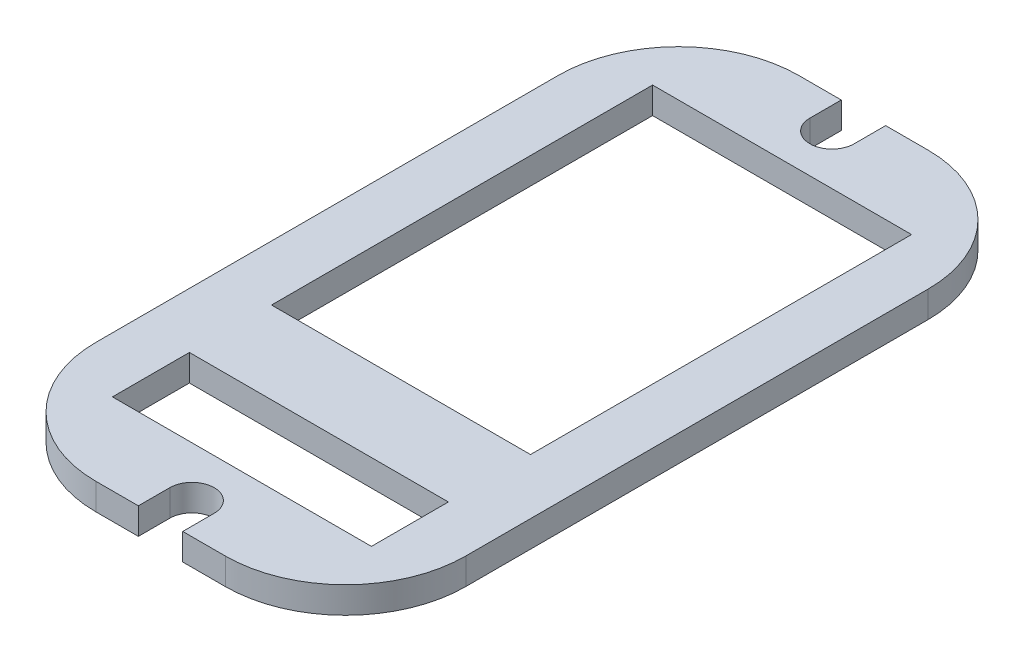
ISO-10303-21;
HEADER;
FILE_DESCRIPTION(('STEP AP214'),'2;1');
FILE_NAME('part.step','',(''),(''),'','','');
FILE_SCHEMA(('AUTOMOTIVE_DESIGN { 1 0 10303 214 1 1 1 1 }'));
ENDSEC;
DATA;
#1=APPLICATION_CONTEXT('core data for automotive mechanical design processes');
#2=APPLICATION_PROTOCOL_DEFINITION('international standard','automotive_design',2000,#1);
#3=PRODUCT_CONTEXT('',#1,'mechanical');
#4=PRODUCT('Part','Part','',(#3));
#5=PRODUCT_RELATED_PRODUCT_CATEGORY('part','',(#4));
#6=PRODUCT_DEFINITION_FORMATION('','',#4);
#7=PRODUCT_DEFINITION_CONTEXT('part definition',#1,'design');
#8=PRODUCT_DEFINITION('design','',#6,#7);
#9=PRODUCT_DEFINITION_SHAPE('','',#8);
#10=(LENGTH_UNIT() NAMED_UNIT(*) SI_UNIT(.MILLI.,.METRE.));
#11=(NAMED_UNIT(*) PLANE_ANGLE_UNIT() SI_UNIT($,.RADIAN.));
#12=(NAMED_UNIT(*) SI_UNIT($,.STERADIAN.) SOLID_ANGLE_UNIT());
#13=UNCERTAINTY_MEASURE_WITH_UNIT(LENGTH_MEASURE(1.E-05),#10,'distance_accuracy_value','');
#14=(GEOMETRIC_REPRESENTATION_CONTEXT(3) GLOBAL_UNCERTAINTY_ASSIGNED_CONTEXT((#13)) GLOBAL_UNIT_ASSIGNED_CONTEXT((#10,
#11,#12)) REPRESENTATION_CONTEXT('',''));
#15=CARTESIAN_POINT('',(0.,0.,0.));
#16=DIRECTION('',(0.,0.,1.));
#17=DIRECTION('',(1.,0.,0.));
#18=AXIS2_PLACEMENT_3D('',#15,#16,#17);
#19=CARTESIAN_POINT('',(0.,0.716,-8.65));
#20=DIRECTION('',(0.,1.,0.));
#21=DIRECTION('',(0.,0.,1.));
#22=AXIS2_PLACEMENT_3D('',#19,#20,#21);
#23=PLANE('',#22);
#24=CARTESIAN_POINT('',(0.,0.716,-8.65));
#25=DIRECTION('',(0.,-1.,0.));
#26=DIRECTION('',(0.,0.,1.));
#27=AXIS2_PLACEMENT_3D('',#24,#25,#26);
#28=CIRCLE('',#27,0.599999999999999);
#29=CARTESIAN_POINT('',(0.599999999999996,0.716,-8.65));
#30=VERTEX_POINT('',#29);
#31=CARTESIAN_POINT('',(-0.600000000000002,0.716,-8.65));
#32=VERTEX_POINT('',#31);
#33=EDGE_CURVE('E261',#30,#32,#28,.T.);
#34=ORIENTED_EDGE('',*,*,#33,.T.);
#35=DIRECTION('',(0.,0.,-1.));
#36=VECTOR('',#35,1.);
#37=CARTESIAN_POINT('',(-0.600000000000005,0.716,-9.5));
#38=LINE('',#37,#36);
#39=CARTESIAN_POINT('',(-0.600000000000005,0.716,-9.5));
#40=VERTEX_POINT('',#39);
#41=EDGE_CURVE('E264',#32,#40,#38,.T.);
#42=ORIENTED_EDGE('',*,*,#41,.T.);
#43=DIRECTION('',(-1.,0.,0.));
#44=VECTOR('',#43,1.);
#45=CARTESIAN_POINT('',(-0.600000000000005,0.716,-9.5));
#46=LINE('',#45,#44);
#47=CARTESIAN_POINT('',(-1.75000000000001,0.716,-9.5));
#48=VERTEX_POINT('',#47);
#49=EDGE_CURVE('E267',#40,#48,#46,.T.);
#50=ORIENTED_EDGE('',*,*,#49,.T.);
#51=CARTESIAN_POINT('',(-1.75000000000001,0.716,-6.25));
#52=DIRECTION('',(0.,1.,0.));
#53=DIRECTION('',(0.,0.,1.));
#54=AXIS2_PLACEMENT_3D('',#51,#52,#53);
#55=CIRCLE('',#54,3.25);
#56=CARTESIAN_POINT('',(-5.,0.716,-6.25));
#57=VERTEX_POINT('',#56);
#58=EDGE_CURVE('E269',#48,#57,#55,.T.);
#59=ORIENTED_EDGE('',*,*,#58,.T.);
#60=DIRECTION('',(0.,0.,1.));
#61=VECTOR('',#60,1.);
#62=CARTESIAN_POINT('',(-5.,0.716,-6.25));
#63=LINE('',#62,#61);
#64=CARTESIAN_POINT('',(-5.,0.716,6.25000000000001));
#65=VERTEX_POINT('',#64);
#66=EDGE_CURVE('E271',#57,#65,#63,.T.);
#67=ORIENTED_EDGE('',*,*,#66,.T.);
#68=CARTESIAN_POINT('',(-1.75000000000001,0.716,6.25000000000001));
#69=DIRECTION('',(0.,1.,0.));
#70=DIRECTION('',(0.,0.,1.));
#71=AXIS2_PLACEMENT_3D('',#68,#69,#70);
#72=CIRCLE('',#71,3.24999999999999);
#73=CARTESIAN_POINT('',(-1.75,0.716,9.5));
#74=VERTEX_POINT('',#73);
#75=EDGE_CURVE('E273',#65,#74,#72,.T.);
#76=ORIENTED_EDGE('',*,*,#75,.T.);
#77=DIRECTION('',(1.,0.,0.));
#78=VECTOR('',#77,1.);
#79=CARTESIAN_POINT('',(-1.75000000000001,0.716,9.5));
#80=LINE('',#79,#78);
#81=CARTESIAN_POINT('',(-0.600000000000005,0.716,9.5));
#82=VERTEX_POINT('',#81);
#83=EDGE_CURVE('E275',#74,#82,#80,.T.);
#84=ORIENTED_EDGE('',*,*,#83,.T.);
#85=DIRECTION('',(0.,0.,-1.));
#86=VECTOR('',#85,1.);
#87=CARTESIAN_POINT('',(-0.599999999999991,0.716,8.65));
#88=LINE('',#87,#86);
#89=CARTESIAN_POINT('',(-0.599999999999991,0.716,8.65));
#90=VERTEX_POINT('',#89);
#91=EDGE_CURVE('E277',#82,#90,#88,.T.);
#92=ORIENTED_EDGE('',*,*,#91,.T.);
#93=CARTESIAN_POINT('',(0.,0.716,8.65));
#94=DIRECTION('',(0.,-1.,0.));
#95=DIRECTION('',(0.,0.,1.));
#96=AXIS2_PLACEMENT_3D('',#93,#94,#95);
#97=CIRCLE('',#96,0.599999999999996);
#98=CARTESIAN_POINT('',(0.599999999999998,0.716,8.65));
#99=VERTEX_POINT('',#98);
#100=EDGE_CURVE('E279',#90,#99,#97,.T.);
#101=ORIENTED_EDGE('',*,*,#100,.T.);
#102=DIRECTION('',(0.,0.,1.));
#103=VECTOR('',#102,1.);
#104=CARTESIAN_POINT('',(0.600000000000001,0.716,8.65));
#105=LINE('',#104,#103);
#106=CARTESIAN_POINT('',(0.599999999999993,0.716,9.5));
#107=VERTEX_POINT('',#106);
#108=EDGE_CURVE('E281',#99,#107,#105,.T.);
#109=ORIENTED_EDGE('',*,*,#108,.T.);
#110=DIRECTION('',(1.,0.,0.));
#111=VECTOR('',#110,1.);
#112=CARTESIAN_POINT('',(0.599999999999993,0.716,9.5));
#113=LINE('',#112,#111);
#114=CARTESIAN_POINT('',(1.75,0.716,9.5));
#115=VERTEX_POINT('',#114);
#116=EDGE_CURVE('E283',#107,#115,#113,.T.);
#117=ORIENTED_EDGE('',*,*,#116,.T.);
#118=CARTESIAN_POINT('',(1.75000000000001,0.716,6.25));
#119=DIRECTION('',(0.,1.,0.));
#120=DIRECTION('',(0.,0.,1.));
#121=AXIS2_PLACEMENT_3D('',#118,#119,#120);
#122=CIRCLE('',#121,3.25);
#123=CARTESIAN_POINT('',(5.,0.716,6.25000000000001));
#124=VERTEX_POINT('',#123);
#125=EDGE_CURVE('E285',#115,#124,#122,.T.);
#126=ORIENTED_EDGE('',*,*,#125,.T.);
#127=DIRECTION('',(0.,0.,-1.));
#128=VECTOR('',#127,1.);
#129=CARTESIAN_POINT('',(5.,0.716,6.25000000000001));
#130=LINE('',#129,#128);
#131=CARTESIAN_POINT('',(5.,0.716,-6.25));
#132=VERTEX_POINT('',#131);
#133=EDGE_CURVE('E287',#124,#132,#130,.T.);
#134=ORIENTED_EDGE('',*,*,#133,.T.);
#135=CARTESIAN_POINT('',(1.75,0.716,-6.25));
#136=DIRECTION('',(0.,1.,0.));
#137=DIRECTION('',(0.,0.,1.));
#138=AXIS2_PLACEMENT_3D('',#135,#136,#137);
#139=CIRCLE('',#138,3.25);
#140=CARTESIAN_POINT('',(1.75,0.716,-9.5));
#141=VERTEX_POINT('',#140);
#142=EDGE_CURVE('E289',#132,#141,#139,.T.);
#143=ORIENTED_EDGE('',*,*,#142,.T.);
#144=DIRECTION('',(-1.,0.,0.));
#145=VECTOR('',#144,1.);
#146=CARTESIAN_POINT('',(1.75,0.716,-9.5));
#147=LINE('',#146,#145);
#148=CARTESIAN_POINT('',(0.599999999999993,0.716,-9.5));
#149=VERTEX_POINT('',#148);
#150=EDGE_CURVE('E291',#141,#149,#147,.T.);
#151=ORIENTED_EDGE('',*,*,#150,.T.);
#152=DIRECTION('',(0.,0.,1.));
#153=VECTOR('',#152,1.);
#154=CARTESIAN_POINT('',(0.599999999999993,0.716,-9.5));
#155=LINE('',#154,#153);
#156=EDGE_CURVE('E293',#149,#30,#155,.T.);
#157=ORIENTED_EDGE('',*,*,#156,.T.);
#158=EDGE_LOOP('',(#34,#42,#50,#59,#67,#76,#84,#92,#101,#109,#117,#126,#134,#143,#151,#157));
#159=FACE_BOUND('',#158,.T.);
#160=DIRECTION('',(1.,0.,0.));
#161=VECTOR('',#160,1.);
#162=CARTESIAN_POINT('',(-3.5,0.716,3.));
#163=LINE('',#162,#161);
#164=CARTESIAN_POINT('',(-3.5,0.716,3.));
#165=VERTEX_POINT('',#164);
#166=CARTESIAN_POINT('',(3.5,0.716,3.));
#167=VERTEX_POINT('',#166);
#168=EDGE_CURVE('E232',#165,#167,#163,.T.);
#169=ORIENTED_EDGE('',*,*,#168,.F.);
#170=DIRECTION('',(0.,0.,1.));
#171=VECTOR('',#170,1.);
#172=CARTESIAN_POINT('',(-3.5,0.716,-7.3));
#173=LINE('',#172,#171);
#174=CARTESIAN_POINT('',(-3.5,0.716,-7.3));
#175=VERTEX_POINT('',#174);
#176=EDGE_CURVE('E230',#175,#165,#173,.T.);
#177=ORIENTED_EDGE('',*,*,#176,.F.);
#178=DIRECTION('',(-1.,0.,0.));
#179=VECTOR('',#178,1.);
#180=CARTESIAN_POINT('',(3.5,0.716,-7.3));
#181=LINE('',#180,#179);
#182=CARTESIAN_POINT('',(3.5,0.716,-7.3));
#183=VERTEX_POINT('',#182);
#184=EDGE_CURVE('E238',#183,#175,#181,.T.);
#185=ORIENTED_EDGE('',*,*,#184,.F.);
#186=DIRECTION('',(0.,0.,-1.));
#187=VECTOR('',#186,1.);
#188=CARTESIAN_POINT('',(3.5,0.716,3.));
#189=LINE('',#188,#187);
#190=EDGE_CURVE('E235',#167,#183,#189,.T.);
#191=ORIENTED_EDGE('',*,*,#190,.F.);
#192=EDGE_LOOP('',(#169,#177,#185,#191));
#193=FACE_BOUND('',#192,.T.);
#194=DIRECTION('',(1.,0.,0.));
#195=VECTOR('',#194,1.);
#196=CARTESIAN_POINT('',(-3.5,0.716,7.3));
#197=LINE('',#196,#195);
#198=CARTESIAN_POINT('',(-3.5,0.716,7.3));
#199=VERTEX_POINT('',#198);
#200=CARTESIAN_POINT('',(3.5,0.716,7.3));
#201=VERTEX_POINT('',#200);
#202=EDGE_CURVE('E202',#199,#201,#197,.T.);
#203=ORIENTED_EDGE('',*,*,#202,.F.);
#204=DIRECTION('',(0.,0.,1.));
#205=VECTOR('',#204,1.);
#206=CARTESIAN_POINT('',(-3.5,0.716,5.22));
#207=LINE('',#206,#205);
#208=CARTESIAN_POINT('',(-3.5,0.716,5.22));
#209=VERTEX_POINT('',#208);
#210=EDGE_CURVE('E194',#209,#199,#207,.T.);
#211=ORIENTED_EDGE('',*,*,#210,.F.);
#212=DIRECTION('',(-1.,0.,0.));
#213=VECTOR('',#212,1.);
#214=CARTESIAN_POINT('',(3.5,0.716,5.22));
#215=LINE('',#214,#213);
#216=CARTESIAN_POINT('',(3.5,0.716,5.22));
#217=VERTEX_POINT('',#216);
#218=EDGE_CURVE('E216',#217,#209,#215,.T.);
#219=ORIENTED_EDGE('',*,*,#218,.F.);
#220=DIRECTION('',(0.,0.,-1.));
#221=VECTOR('',#220,1.);
#222=CARTESIAN_POINT('',(3.5,0.716,7.3));
#223=LINE('',#222,#221);
#224=EDGE_CURVE('E214',#201,#217,#223,.T.);
#225=ORIENTED_EDGE('',*,*,#224,.F.);
#226=EDGE_LOOP('',(#203,#211,#219,#225));
#227=FACE_BOUND('',#226,.T.);
#228=ADVANCED_FACE('F33',(#159,#193,#227),#23,.T.);
#229=CARTESIAN_POINT('',(0.,0.,-8.65));
#230=DIRECTION('',(0.,1.,0.));
#231=DIRECTION('',(0.,0.,1.));
#232=AXIS2_PLACEMENT_3D('',#229,#230,#231);
#233=PLANE('',#232);
#234=DIRECTION('',(0.,0.,1.));
#235=VECTOR('',#234,1.);
#236=CARTESIAN_POINT('',(-3.5,0.,-7.3));
#237=LINE('',#236,#235);
#238=CARTESIAN_POINT('',(-3.5,0.,-7.3));
#239=VERTEX_POINT('',#238);
#240=CARTESIAN_POINT('',(-3.5,0.,3.));
#241=VERTEX_POINT('',#240);
#242=EDGE_CURVE('E210',#239,#241,#237,.T.);
#243=ORIENTED_EDGE('',*,*,#242,.T.);
#244=DIRECTION('',(1.,0.,0.));
#245=VECTOR('',#244,1.);
#246=CARTESIAN_POINT('',(-3.5,0.,3.));
#247=LINE('',#246,#245);
#248=CARTESIAN_POINT('',(3.5,0.,3.));
#249=VERTEX_POINT('',#248);
#250=EDGE_CURVE('E243',#241,#249,#247,.T.);
#251=ORIENTED_EDGE('',*,*,#250,.T.);
#252=DIRECTION('',(0.,0.,-1.));
#253=VECTOR('',#252,1.);
#254=CARTESIAN_POINT('',(3.5,0.,3.));
#255=LINE('',#254,#253);
#256=CARTESIAN_POINT('',(3.5,0.,-7.3));
#257=VERTEX_POINT('',#256);
#258=EDGE_CURVE('E246',#249,#257,#255,.T.);
#259=ORIENTED_EDGE('',*,*,#258,.T.);
#260=DIRECTION('',(-1.,0.,0.));
#261=VECTOR('',#260,1.);
#262=CARTESIAN_POINT('',(3.5,0.,-7.3));
#263=LINE('',#262,#261);
#264=EDGE_CURVE('E233',#257,#239,#263,.T.);
#265=ORIENTED_EDGE('',*,*,#264,.T.);
#266=EDGE_LOOP('',(#243,#251,#259,#265));
#267=FACE_BOUND('',#266,.T.);
#268=CARTESIAN_POINT('',(0.,0.,-8.65));
#269=DIRECTION('',(0.,-1.,0.));
#270=DIRECTION('',(0.,0.,1.));
#271=AXIS2_PLACEMENT_3D('',#268,#269,#270);
#272=CIRCLE('',#271,0.599999999999999);
#273=CARTESIAN_POINT('',(0.599999999999996,0.,-8.65));
#274=VERTEX_POINT('',#273);
#275=CARTESIAN_POINT('',(-0.600000000000002,0.,-8.65));
#276=VERTEX_POINT('',#275);
#277=EDGE_CURVE('E260',#274,#276,#272,.T.);
#278=ORIENTED_EDGE('',*,*,#277,.F.);
#279=DIRECTION('',(0.,0.,1.));
#280=VECTOR('',#279,1.);
#281=CARTESIAN_POINT('',(0.599999999999993,0.,-9.5));
#282=LINE('',#281,#280);
#283=CARTESIAN_POINT('',(0.599999999999993,0.,-9.5));
#284=VERTEX_POINT('',#283);
#285=EDGE_CURVE('E265',#284,#274,#282,.T.);
#286=ORIENTED_EDGE('',*,*,#285,.F.);
#287=DIRECTION('',(-1.,0.,0.));
#288=VECTOR('',#287,1.);
#289=CARTESIAN_POINT('',(1.75,0.,-9.5));
#290=LINE('',#289,#288);
#291=CARTESIAN_POINT('',(1.75,0.,-9.5));
#292=VERTEX_POINT('',#291);
#293=EDGE_CURVE('E324',#292,#284,#290,.T.);
#294=ORIENTED_EDGE('',*,*,#293,.F.);
#295=CARTESIAN_POINT('',(1.75,0.,-6.25));
#296=DIRECTION('',(0.,1.,0.));
#297=DIRECTION('',(0.,0.,1.));
#298=AXIS2_PLACEMENT_3D('',#295,#296,#297);
#299=CIRCLE('',#298,3.25);
#300=CARTESIAN_POINT('',(5.,0.,-6.25));
#301=VERTEX_POINT('',#300);
#302=EDGE_CURVE('E322',#301,#292,#299,.T.);
#303=ORIENTED_EDGE('',*,*,#302,.F.);
#304=DIRECTION('',(0.,0.,-1.));
#305=VECTOR('',#304,1.);
#306=CARTESIAN_POINT('',(5.,0.,6.25000000000001));
#307=LINE('',#306,#305);
#308=CARTESIAN_POINT('',(5.,0.,6.25000000000001));
#309=VERTEX_POINT('',#308);
#310=EDGE_CURVE('E320',#309,#301,#307,.T.);
#311=ORIENTED_EDGE('',*,*,#310,.F.);
#312=CARTESIAN_POINT('',(1.75000000000001,0.,6.25));
#313=DIRECTION('',(0.,1.,0.));
#314=DIRECTION('',(0.,0.,1.));
#315=AXIS2_PLACEMENT_3D('',#312,#313,#314);
#316=CIRCLE('',#315,3.25);
#317=CARTESIAN_POINT('',(1.75,0.,9.5));
#318=VERTEX_POINT('',#317);
#319=EDGE_CURVE('E318',#318,#309,#316,.T.);
#320=ORIENTED_EDGE('',*,*,#319,.F.);
#321=DIRECTION('',(1.,0.,0.));
#322=VECTOR('',#321,1.);
#323=CARTESIAN_POINT('',(0.599999999999993,0.,9.5));
#324=LINE('',#323,#322);
#325=CARTESIAN_POINT('',(0.599999999999993,0.,9.5));
#326=VERTEX_POINT('',#325);
#327=EDGE_CURVE('E316',#326,#318,#324,.T.);
#328=ORIENTED_EDGE('',*,*,#327,.F.);
#329=DIRECTION('',(0.,0.,1.));
#330=VECTOR('',#329,1.);
#331=CARTESIAN_POINT('',(0.600000000000001,0.,8.65));
#332=LINE('',#331,#330);
#333=CARTESIAN_POINT('',(0.599999999999998,0.,8.65));
#334=VERTEX_POINT('',#333);
#335=EDGE_CURVE('E314',#334,#326,#332,.T.);
#336=ORIENTED_EDGE('',*,*,#335,.F.);
#337=CARTESIAN_POINT('',(0.,0.,8.65));
#338=DIRECTION('',(0.,-1.,0.));
#339=DIRECTION('',(0.,0.,1.));
#340=AXIS2_PLACEMENT_3D('',#337,#338,#339);
#341=CIRCLE('',#340,0.599999999999996);
#342=CARTESIAN_POINT('',(-0.599999999999991,0.,8.65));
#343=VERTEX_POINT('',#342);
#344=EDGE_CURVE('E312',#343,#334,#341,.T.);
#345=ORIENTED_EDGE('',*,*,#344,.F.);
#346=DIRECTION('',(0.,0.,-1.));
#347=VECTOR('',#346,1.);
#348=CARTESIAN_POINT('',(-0.599999999999991,0.,8.65));
#349=LINE('',#348,#347);
#350=CARTESIAN_POINT('',(-0.600000000000005,0.,9.5));
#351=VERTEX_POINT('',#350);
#352=EDGE_CURVE('E310',#351,#343,#349,.T.);
#353=ORIENTED_EDGE('',*,*,#352,.F.);
#354=DIRECTION('',(1.,0.,0.));
#355=VECTOR('',#354,1.);
#356=CARTESIAN_POINT('',(-1.75000000000001,0.,9.5));
#357=LINE('',#356,#355);
#358=CARTESIAN_POINT('',(-1.75,0.,9.5));
#359=VERTEX_POINT('',#358);
#360=EDGE_CURVE('E308',#359,#351,#357,.T.);
#361=ORIENTED_EDGE('',*,*,#360,.F.);
#362=CARTESIAN_POINT('',(-1.75000000000001,0.,6.25000000000001));
#363=DIRECTION('',(0.,1.,0.));
#364=DIRECTION('',(0.,0.,1.));
#365=AXIS2_PLACEMENT_3D('',#362,#363,#364);
#366=CIRCLE('',#365,3.24999999999999);
#367=CARTESIAN_POINT('',(-5.,0.,6.25000000000001));
#368=VERTEX_POINT('',#367);
#369=EDGE_CURVE('E306',#368,#359,#366,.T.);
#370=ORIENTED_EDGE('',*,*,#369,.F.);
#371=DIRECTION('',(0.,0.,1.));
#372=VECTOR('',#371,1.);
#373=CARTESIAN_POINT('',(-5.,0.,-6.25));
#374=LINE('',#373,#372);
#375=CARTESIAN_POINT('',(-5.,0.,-6.25));
#376=VERTEX_POINT('',#375);
#377=EDGE_CURVE('E304',#376,#368,#374,.T.);
#378=ORIENTED_EDGE('',*,*,#377,.F.);
#379=CARTESIAN_POINT('',(-1.75000000000001,0.,-6.25));
#380=DIRECTION('',(0.,1.,0.));
#381=DIRECTION('',(0.,0.,1.));
#382=AXIS2_PLACEMENT_3D('',#379,#380,#381);
#383=CIRCLE('',#382,3.25);
#384=CARTESIAN_POINT('',(-1.75000000000001,0.,-9.5));
#385=VERTEX_POINT('',#384);
#386=EDGE_CURVE('E302',#385,#376,#383,.T.);
#387=ORIENTED_EDGE('',*,*,#386,.F.);
#388=DIRECTION('',(-1.,0.,0.));
#389=VECTOR('',#388,1.);
#390=CARTESIAN_POINT('',(-0.600000000000005,0.,-9.5));
#391=LINE('',#390,#389);
#392=CARTESIAN_POINT('',(-0.600000000000005,0.,-9.5));
#393=VERTEX_POINT('',#392);
#394=EDGE_CURVE('E300',#393,#385,#391,.T.);
#395=ORIENTED_EDGE('',*,*,#394,.F.);
#396=DIRECTION('',(0.,0.,-1.));
#397=VECTOR('',#396,1.);
#398=CARTESIAN_POINT('',(-0.600000000000005,0.,-9.5));
#399=LINE('',#398,#397);
#400=EDGE_CURVE('E298',#276,#393,#399,.T.);
#401=ORIENTED_EDGE('',*,*,#400,.F.);
#402=EDGE_LOOP('',(#278,#286,#294,#303,#311,#320,#328,#336,#345,#353,#361,#370,#378,#387,#395,#401));
#403=FACE_BOUND('',#402,.T.);
#404=DIRECTION('',(0.,0.,1.));
#405=VECTOR('',#404,1.);
#406=CARTESIAN_POINT('',(-3.5,0.,5.22));
#407=LINE('',#406,#405);
#408=CARTESIAN_POINT('',(-3.5,0.,5.22));
#409=VERTEX_POINT('',#408);
#410=CARTESIAN_POINT('',(-3.5,0.,7.3));
#411=VERTEX_POINT('',#410);
#412=EDGE_CURVE('E56',#409,#411,#407,.T.);
#413=ORIENTED_EDGE('',*,*,#412,.T.);
#414=DIRECTION('',(1.,0.,0.));
#415=VECTOR('',#414,1.);
#416=CARTESIAN_POINT('',(-3.5,0.,7.3));
#417=LINE('',#416,#415);
#418=CARTESIAN_POINT('',(3.5,0.,7.3));
#419=VERTEX_POINT('',#418);
#420=EDGE_CURVE('E209',#411,#419,#417,.T.);
#421=ORIENTED_EDGE('',*,*,#420,.T.);
#422=DIRECTION('',(0.,0.,-1.));
#423=VECTOR('',#422,1.);
#424=CARTESIAN_POINT('',(3.5,0.,7.3));
#425=LINE('',#424,#423);
#426=CARTESIAN_POINT('',(3.5,0.,5.22));
#427=VERTEX_POINT('',#426);
#428=EDGE_CURVE('E222',#419,#427,#425,.T.);
#429=ORIENTED_EDGE('',*,*,#428,.T.);
#430=DIRECTION('',(-1.,0.,0.));
#431=VECTOR('',#430,1.);
#432=CARTESIAN_POINT('',(3.5,0.,5.22));
#433=LINE('',#432,#431);
#434=EDGE_CURVE('E203',#427,#409,#433,.T.);
#435=ORIENTED_EDGE('',*,*,#434,.T.);
#436=EDGE_LOOP('',(#413,#421,#429,#435));
#437=FACE_BOUND('',#436,.T.);
#438=ADVANCED_FACE('F378',(#267,#403,#437),#233,.F.);
#439=CARTESIAN_POINT('',(0.,0.716,-8.65));
#440=DIRECTION('',(0.,-1.,0.));
#441=DIRECTION('',(0.,0.,-1.));
#442=AXIS2_PLACEMENT_3D('',#439,#440,#441);
#443=CYLINDRICAL_SURFACE('',#442,0.599999999999999);
#444=ORIENTED_EDGE('',*,*,#277,.T.);
#445=DIRECTION('',(0.,-1.,0.));
#446=VECTOR('',#445,1.);
#447=CARTESIAN_POINT('',(-0.600000000000002,0.716,-8.65));
#448=LINE('',#447,#446);
#449=EDGE_CURVE('E11',#32,#276,#448,.T.);
#450=ORIENTED_EDGE('',*,*,#449,.F.);
#451=ORIENTED_EDGE('',*,*,#33,.F.);
#452=DIRECTION('',(0.,-1.,0.));
#453=VECTOR('',#452,1.);
#454=CARTESIAN_POINT('',(0.599999999999996,0.716,-8.65));
#455=LINE('',#454,#453);
#456=EDGE_CURVE('E295',#30,#274,#455,.T.);
#457=ORIENTED_EDGE('',*,*,#456,.T.);
#458=EDGE_LOOP('',(#444,#450,#451,#457));
#459=FACE_BOUND('',#458,.T.);
#460=ADVANCED_FACE('F35',(#459),#443,.F.);
#461=CARTESIAN_POINT('',(-0.600000000000005,0.716,-9.5));
#462=DIRECTION('',(-1.,0.,0.));
#463=DIRECTION('',(0.,0.,1.));
#464=AXIS2_PLACEMENT_3D('',#461,#462,#463);
#465=PLANE('',#464);
#466=ORIENTED_EDGE('',*,*,#400,.T.);
#467=DIRECTION('',(0.,-1.,0.));
#468=VECTOR('',#467,1.);
#469=CARTESIAN_POINT('',(-0.600000000000005,0.716,-9.5));
#470=LINE('',#469,#468);
#471=EDGE_CURVE('E41',#40,#393,#470,.T.);
#472=ORIENTED_EDGE('',*,*,#471,.F.);
#473=ORIENTED_EDGE('',*,*,#41,.F.);
#474=ORIENTED_EDGE('',*,*,#449,.T.);
#475=EDGE_LOOP('',(#466,#472,#473,#474));
#476=FACE_BOUND('',#475,.T.);
#477=ADVANCED_FACE('F396',(#476),#465,.F.);
#478=CARTESIAN_POINT('',(-0.600000000000005,0.716,-9.5));
#479=DIRECTION('',(0.,0.,1.));
#480=DIRECTION('',(1.,0.,0.));
#481=AXIS2_PLACEMENT_3D('',#478,#479,#480);
#482=PLANE('',#481);
#483=ORIENTED_EDGE('',*,*,#394,.T.);
#484=DIRECTION('',(0.,-1.,0.));
#485=VECTOR('',#484,1.);
#486=CARTESIAN_POINT('',(-1.75000000000001,0.716,-9.5));
#487=LINE('',#486,#485);
#488=EDGE_CURVE('E365',#48,#385,#487,.T.);
#489=ORIENTED_EDGE('',*,*,#488,.F.);
#490=ORIENTED_EDGE('',*,*,#49,.F.);
#491=ORIENTED_EDGE('',*,*,#471,.T.);
#492=EDGE_LOOP('',(#483,#489,#490,#491));
#493=FACE_BOUND('',#492,.T.);
#494=ADVANCED_FACE('F372',(#493),#482,.F.);
#495=CARTESIAN_POINT('',(-1.75000000000001,0.716,-6.25));
#496=DIRECTION('',(0.,-1.,0.));
#497=DIRECTION('',(0.,0.,-1.));
#498=AXIS2_PLACEMENT_3D('',#495,#496,#497);
#499=CYLINDRICAL_SURFACE('',#498,3.25);
#500=ORIENTED_EDGE('',*,*,#386,.T.);
#501=DIRECTION('',(0.,-1.,0.));
#502=VECTOR('',#501,1.);
#503=CARTESIAN_POINT('',(-5.,0.716,-6.25));
#504=LINE('',#503,#502);
#505=EDGE_CURVE('E362',#57,#376,#504,.T.);
#506=ORIENTED_EDGE('',*,*,#505,.F.);
#507=ORIENTED_EDGE('',*,*,#58,.F.);
#508=ORIENTED_EDGE('',*,*,#488,.T.);
#509=EDGE_LOOP('',(#500,#506,#507,#508));
#510=FACE_BOUND('',#509,.T.);
#511=ADVANCED_FACE('F384',(#510),#499,.T.);
#512=CARTESIAN_POINT('',(-5.,0.716,-6.25));
#513=DIRECTION('',(1.,0.,0.));
#514=DIRECTION('',(0.,0.,-1.));
#515=AXIS2_PLACEMENT_3D('',#512,#513,#514);
#516=PLANE('',#515);
#517=ORIENTED_EDGE('',*,*,#377,.T.);
#518=DIRECTION('',(0.,-1.,0.));
#519=VECTOR('',#518,1.);
#520=CARTESIAN_POINT('',(-5.,0.716,6.25000000000001));
#521=LINE('',#520,#519);
#522=EDGE_CURVE('E359',#65,#368,#521,.T.);
#523=ORIENTED_EDGE('',*,*,#522,.F.);
#524=ORIENTED_EDGE('',*,*,#66,.F.);
#525=ORIENTED_EDGE('',*,*,#505,.T.);
#526=EDGE_LOOP('',(#517,#523,#524,#525));
#527=FACE_BOUND('',#526,.T.);
#528=ADVANCED_FACE('F388',(#527),#516,.F.);
#529=CARTESIAN_POINT('',(-1.75000000000001,0.716,6.25000000000001));
#530=DIRECTION('',(0.,-1.,0.));
#531=DIRECTION('',(0.,0.,-1.));
#532=AXIS2_PLACEMENT_3D('',#529,#530,#531);
#533=CYLINDRICAL_SURFACE('',#532,3.24999999999999);
#534=ORIENTED_EDGE('',*,*,#369,.T.);
#535=DIRECTION('',(0.,-1.,0.));
#536=VECTOR('',#535,1.);
#537=CARTESIAN_POINT('',(-1.75,0.716,9.5));
#538=LINE('',#537,#536);
#539=EDGE_CURVE('E356',#74,#359,#538,.T.);
#540=ORIENTED_EDGE('',*,*,#539,.F.);
#541=ORIENTED_EDGE('',*,*,#75,.F.);
#542=ORIENTED_EDGE('',*,*,#522,.T.);
#543=EDGE_LOOP('',(#534,#540,#541,#542));
#544=FACE_BOUND('',#543,.T.);
#545=ADVANCED_FACE('F449',(#544),#533,.T.);
#546=CARTESIAN_POINT('',(-1.75000000000001,0.716,9.5));
#547=DIRECTION('',(0.,0.,-1.));
#548=DIRECTION('',(-1.,0.,0.));
#549=AXIS2_PLACEMENT_3D('',#546,#547,#548);
#550=PLANE('',#549);
#551=ORIENTED_EDGE('',*,*,#360,.T.);
#552=DIRECTION('',(0.,-1.,0.));
#553=VECTOR('',#552,1.);
#554=CARTESIAN_POINT('',(-0.600000000000005,0.716,9.5));
#555=LINE('',#554,#553);
#556=EDGE_CURVE('E353',#82,#351,#555,.T.);
#557=ORIENTED_EDGE('',*,*,#556,.F.);
#558=ORIENTED_EDGE('',*,*,#83,.F.);
#559=ORIENTED_EDGE('',*,*,#539,.T.);
#560=EDGE_LOOP('',(#551,#557,#558,#559));
#561=FACE_BOUND('',#560,.T.);
#562=ADVANCED_FACE('F446',(#561),#550,.F.);
#563=CARTESIAN_POINT('',(-0.599999999999991,0.716,8.65));
#564=DIRECTION('',(-1.,0.,0.));
#565=DIRECTION('',(0.,0.,1.));
#566=AXIS2_PLACEMENT_3D('',#563,#564,#565);
#567=PLANE('',#566);
#568=ORIENTED_EDGE('',*,*,#352,.T.);
#569=DIRECTION('',(0.,-1.,0.));
#570=VECTOR('',#569,1.);
#571=CARTESIAN_POINT('',(-0.599999999999991,0.716,8.65));
#572=LINE('',#571,#570);
#573=EDGE_CURVE('E350',#90,#343,#572,.T.);
#574=ORIENTED_EDGE('',*,*,#573,.F.);
#575=ORIENTED_EDGE('',*,*,#91,.F.);
#576=ORIENTED_EDGE('',*,*,#556,.T.);
#577=EDGE_LOOP('',(#568,#574,#575,#576));
#578=FACE_BOUND('',#577,.T.);
#579=ADVANCED_FACE('F442',(#578),#567,.F.);
#580=CARTESIAN_POINT('',(0.,0.716,8.65));
#581=DIRECTION('',(0.,-1.,0.));
#582=DIRECTION('',(0.,0.,-1.));
#583=AXIS2_PLACEMENT_3D('',#580,#581,#582);
#584=CYLINDRICAL_SURFACE('',#583,0.599999999999996);
#585=ORIENTED_EDGE('',*,*,#344,.T.);
#586=DIRECTION('',(0.,-1.,0.));
#587=VECTOR('',#586,1.);
#588=CARTESIAN_POINT('',(0.599999999999998,0.716,8.65));
#589=LINE('',#588,#587);
#590=EDGE_CURVE('E347',#99,#334,#589,.T.);
#591=ORIENTED_EDGE('',*,*,#590,.F.);
#592=ORIENTED_EDGE('',*,*,#100,.F.);
#593=ORIENTED_EDGE('',*,*,#573,.T.);
#594=EDGE_LOOP('',(#585,#591,#592,#593));
#595=FACE_BOUND('',#594,.T.);
#596=ADVANCED_FACE('F438',(#595),#584,.F.);
#597=CARTESIAN_POINT('',(0.600000000000001,0.716,8.65));
#598=DIRECTION('',(1.,0.,0.));
#599=DIRECTION('',(0.,0.,-1.));
#600=AXIS2_PLACEMENT_3D('',#597,#598,#599);
#601=PLANE('',#600);
#602=ORIENTED_EDGE('',*,*,#335,.T.);
#603=DIRECTION('',(0.,-1.,0.));
#604=VECTOR('',#603,1.);
#605=CARTESIAN_POINT('',(0.599999999999993,0.716,9.5));
#606=LINE('',#605,#604);
#607=EDGE_CURVE('E344',#107,#326,#606,.T.);
#608=ORIENTED_EDGE('',*,*,#607,.F.);
#609=ORIENTED_EDGE('',*,*,#108,.F.);
#610=ORIENTED_EDGE('',*,*,#590,.T.);
#611=EDGE_LOOP('',(#602,#608,#609,#610));
#612=FACE_BOUND('',#611,.T.);
#613=ADVANCED_FACE('F433',(#612),#601,.F.);
#614=CARTESIAN_POINT('',(0.599999999999993,0.716,9.5));
#615=DIRECTION('',(0.,0.,-1.));
#616=DIRECTION('',(-1.,0.,0.));
#617=AXIS2_PLACEMENT_3D('',#614,#615,#616);
#618=PLANE('',#617);
#619=ORIENTED_EDGE('',*,*,#327,.T.);
#620=DIRECTION('',(0.,-1.,0.));
#621=VECTOR('',#620,1.);
#622=CARTESIAN_POINT('',(1.75,0.716,9.5));
#623=LINE('',#622,#621);
#624=EDGE_CURVE('E341',#115,#318,#623,.T.);
#625=ORIENTED_EDGE('',*,*,#624,.F.);
#626=ORIENTED_EDGE('',*,*,#116,.F.);
#627=ORIENTED_EDGE('',*,*,#607,.T.);
#628=EDGE_LOOP('',(#619,#625,#626,#627));
#629=FACE_BOUND('',#628,.T.);
#630=ADVANCED_FACE('F427',(#629),#618,.F.);
#631=CARTESIAN_POINT('',(1.75000000000001,0.716,6.25));
#632=DIRECTION('',(0.,-1.,0.));
#633=DIRECTION('',(0.,0.,-1.));
#634=AXIS2_PLACEMENT_3D('',#631,#632,#633);
#635=CYLINDRICAL_SURFACE('',#634,3.25);
#636=ORIENTED_EDGE('',*,*,#319,.T.);
#637=DIRECTION('',(0.,-1.,0.));
#638=VECTOR('',#637,1.);
#639=CARTESIAN_POINT('',(5.,0.716,6.25000000000001));
#640=LINE('',#639,#638);
#641=EDGE_CURVE('E338',#124,#309,#640,.T.);
#642=ORIENTED_EDGE('',*,*,#641,.F.);
#643=ORIENTED_EDGE('',*,*,#125,.F.);
#644=ORIENTED_EDGE('',*,*,#624,.T.);
#645=EDGE_LOOP('',(#636,#642,#643,#644));
#646=FACE_BOUND('',#645,.T.);
#647=ADVANCED_FACE('F423',(#646),#635,.T.);
#648=CARTESIAN_POINT('',(5.,0.716,6.25000000000001));
#649=DIRECTION('',(-1.,0.,0.));
#650=DIRECTION('',(0.,0.,1.));
#651=AXIS2_PLACEMENT_3D('',#648,#649,#650);
#652=PLANE('',#651);
#653=ORIENTED_EDGE('',*,*,#310,.T.);
#654=DIRECTION('',(0.,-1.,0.));
#655=VECTOR('',#654,1.);
#656=CARTESIAN_POINT('',(5.,0.716,-6.25));
#657=LINE('',#656,#655);
#658=EDGE_CURVE('E335',#132,#301,#657,.T.);
#659=ORIENTED_EDGE('',*,*,#658,.F.);
#660=ORIENTED_EDGE('',*,*,#133,.F.);
#661=ORIENTED_EDGE('',*,*,#641,.T.);
#662=EDGE_LOOP('',(#653,#659,#660,#661));
#663=FACE_BOUND('',#662,.T.);
#664=ADVANCED_FACE('F418',(#663),#652,.F.);
#665=CARTESIAN_POINT('',(1.75,0.716,-6.25));
#666=DIRECTION('',(0.,-1.,0.));
#667=DIRECTION('',(0.,0.,-1.));
#668=AXIS2_PLACEMENT_3D('',#665,#666,#667);
#669=CYLINDRICAL_SURFACE('',#668,3.25);
#670=ORIENTED_EDGE('',*,*,#302,.T.);
#671=DIRECTION('',(0.,-1.,0.));
#672=VECTOR('',#671,1.);
#673=CARTESIAN_POINT('',(1.75,0.716,-9.5));
#674=LINE('',#673,#672);
#675=EDGE_CURVE('E332',#141,#292,#674,.T.);
#676=ORIENTED_EDGE('',*,*,#675,.F.);
#677=ORIENTED_EDGE('',*,*,#142,.F.);
#678=ORIENTED_EDGE('',*,*,#658,.T.);
#679=EDGE_LOOP('',(#670,#676,#677,#678));
#680=FACE_BOUND('',#679,.T.);
#681=ADVANCED_FACE('F412',(#680),#669,.T.);
#682=CARTESIAN_POINT('',(1.75,0.716,-9.5));
#683=DIRECTION('',(0.,0.,1.));
#684=DIRECTION('',(1.,0.,0.));
#685=AXIS2_PLACEMENT_3D('',#682,#683,#684);
#686=PLANE('',#685);
#687=ORIENTED_EDGE('',*,*,#293,.T.);
#688=DIRECTION('',(0.,-1.,0.));
#689=VECTOR('',#688,1.);
#690=CARTESIAN_POINT('',(0.599999999999993,0.716,-9.5));
#691=LINE('',#690,#689);
#692=EDGE_CURVE('E329',#149,#284,#691,.T.);
#693=ORIENTED_EDGE('',*,*,#692,.F.);
#694=ORIENTED_EDGE('',*,*,#150,.F.);
#695=ORIENTED_EDGE('',*,*,#675,.T.);
#696=EDGE_LOOP('',(#687,#693,#694,#695));
#697=FACE_BOUND('',#696,.T.);
#698=ADVANCED_FACE('F408',(#697),#686,.F.);
#699=CARTESIAN_POINT('',(0.599999999999993,0.716,-9.5));
#700=DIRECTION('',(1.,0.,0.));
#701=DIRECTION('',(0.,0.,-1.));
#702=AXIS2_PLACEMENT_3D('',#699,#700,#701);
#703=PLANE('',#702);
#704=ORIENTED_EDGE('',*,*,#285,.T.);
#705=ORIENTED_EDGE('',*,*,#456,.F.);
#706=ORIENTED_EDGE('',*,*,#156,.F.);
#707=ORIENTED_EDGE('',*,*,#692,.T.);
#708=EDGE_LOOP('',(#704,#705,#706,#707));
#709=FACE_BOUND('',#708,.T.);
#710=ADVANCED_FACE('F403',(#709),#703,.F.);
#711=CARTESIAN_POINT('',(-3.5,0.716,-7.3));
#712=DIRECTION('',(1.,0.,0.));
#713=DIRECTION('',(0.,0.,-1.));
#714=AXIS2_PLACEMENT_3D('',#711,#712,#713);
#715=PLANE('',#714);
#716=ORIENTED_EDGE('',*,*,#242,.F.);
#717=DIRECTION('',(0.,-1.,0.));
#718=VECTOR('',#717,1.);
#719=CARTESIAN_POINT('',(-3.5,0.716,-7.3));
#720=LINE('',#719,#718);
#721=EDGE_CURVE('E240',#175,#239,#720,.T.);
#722=ORIENTED_EDGE('',*,*,#721,.F.);
#723=ORIENTED_EDGE('',*,*,#176,.T.);
#724=DIRECTION('',(0.,-1.,0.));
#725=VECTOR('',#724,1.);
#726=CARTESIAN_POINT('',(-3.5,0.716,3.));
#727=LINE('',#726,#725);
#728=EDGE_CURVE('E257',#165,#241,#727,.T.);
#729=ORIENTED_EDGE('',*,*,#728,.T.);
#730=EDGE_LOOP('',(#716,#722,#723,#729));
#731=FACE_BOUND('',#730,.T.);
#732=ADVANCED_FACE('F466',(#731),#715,.T.);
#733=CARTESIAN_POINT('',(-3.5,0.716,3.));
#734=DIRECTION('',(0.,0.,-1.));
#735=DIRECTION('',(-1.,0.,0.));
#736=AXIS2_PLACEMENT_3D('',#733,#734,#735);
#737=PLANE('',#736);
#738=ORIENTED_EDGE('',*,*,#250,.F.);
#739=ORIENTED_EDGE('',*,*,#728,.F.);
#740=ORIENTED_EDGE('',*,*,#168,.T.);
#741=DIRECTION('',(0.,-1.,0.));
#742=VECTOR('',#741,1.);
#743=CARTESIAN_POINT('',(3.5,0.716,3.));
#744=LINE('',#743,#742);
#745=EDGE_CURVE('E255',#167,#249,#744,.T.);
#746=ORIENTED_EDGE('',*,*,#745,.T.);
#747=EDGE_LOOP('',(#738,#739,#740,#746));
#748=FACE_BOUND('',#747,.T.);
#749=ADVANCED_FACE('F528',(#748),#737,.T.);
#750=CARTESIAN_POINT('',(3.5,0.716,3.));
#751=DIRECTION('',(-1.,0.,0.));
#752=DIRECTION('',(0.,0.,1.));
#753=AXIS2_PLACEMENT_3D('',#750,#751,#752);
#754=PLANE('',#753);
#755=ORIENTED_EDGE('',*,*,#258,.F.);
#756=ORIENTED_EDGE('',*,*,#745,.F.);
#757=ORIENTED_EDGE('',*,*,#190,.T.);
#758=DIRECTION('',(0.,-1.,0.));
#759=VECTOR('',#758,1.);
#760=CARTESIAN_POINT('',(3.5,0.716,-7.3));
#761=LINE('',#760,#759);
#762=EDGE_CURVE('E253',#183,#257,#761,.T.);
#763=ORIENTED_EDGE('',*,*,#762,.T.);
#764=EDGE_LOOP('',(#755,#756,#757,#763));
#765=FACE_BOUND('',#764,.T.);
#766=ADVANCED_FACE('F535',(#765),#754,.T.);
#767=CARTESIAN_POINT('',(3.5,0.716,-7.3));
#768=DIRECTION('',(0.,0.,1.));
#769=DIRECTION('',(1.,0.,0.));
#770=AXIS2_PLACEMENT_3D('',#767,#768,#769);
#771=PLANE('',#770);
#772=ORIENTED_EDGE('',*,*,#264,.F.);
#773=ORIENTED_EDGE('',*,*,#762,.F.);
#774=ORIENTED_EDGE('',*,*,#184,.T.);
#775=ORIENTED_EDGE('',*,*,#721,.T.);
#776=EDGE_LOOP('',(#772,#773,#774,#775));
#777=FACE_BOUND('',#776,.T.);
#778=ADVANCED_FACE('F542',(#777),#771,.T.);
#779=CARTESIAN_POINT('',(-3.5,0.716,5.22));
#780=DIRECTION('',(1.,0.,0.));
#781=DIRECTION('',(0.,0.,-1.));
#782=AXIS2_PLACEMENT_3D('',#779,#780,#781);
#783=PLANE('',#782);
#784=ORIENTED_EDGE('',*,*,#412,.F.);
#785=DIRECTION('',(0.,-1.,0.));
#786=VECTOR('',#785,1.);
#787=CARTESIAN_POINT('',(-3.5,0.716,5.22));
#788=LINE('',#787,#786);
#789=EDGE_CURVE('E198',#209,#409,#788,.T.);
#790=ORIENTED_EDGE('',*,*,#789,.F.);
#791=ORIENTED_EDGE('',*,*,#210,.T.);
#792=DIRECTION('',(0.,-1.,0.));
#793=VECTOR('',#792,1.);
#794=CARTESIAN_POINT('',(-3.5,0.716,7.3));
#795=LINE('',#794,#793);
#796=EDGE_CURVE('E197',#199,#411,#795,.T.);
#797=ORIENTED_EDGE('',*,*,#796,.T.);
#798=EDGE_LOOP('',(#784,#790,#791,#797));
#799=FACE_BOUND('',#798,.T.);
#800=ADVANCED_FACE('F196',(#799),#783,.T.);
#801=CARTESIAN_POINT('',(-3.5,0.716,7.3));
#802=DIRECTION('',(0.,0.,-1.));
#803=DIRECTION('',(-1.,0.,0.));
#804=AXIS2_PLACEMENT_3D('',#801,#802,#803);
#805=PLANE('',#804);
#806=ORIENTED_EDGE('',*,*,#420,.F.);
#807=ORIENTED_EDGE('',*,*,#796,.F.);
#808=ORIENTED_EDGE('',*,*,#202,.T.);
#809=DIRECTION('',(0.,-1.,0.));
#810=VECTOR('',#809,1.);
#811=CARTESIAN_POINT('',(3.5,0.716,7.3));
#812=LINE('',#811,#810);
#813=EDGE_CURVE('E211',#201,#419,#812,.T.);
#814=ORIENTED_EDGE('',*,*,#813,.T.);
#815=EDGE_LOOP('',(#806,#807,#808,#814));
#816=FACE_BOUND('',#815,.T.);
#817=ADVANCED_FACE('F206',(#816),#805,.T.);
#818=CARTESIAN_POINT('',(3.5,0.716,7.3));
#819=DIRECTION('',(-1.,0.,0.));
#820=DIRECTION('',(0.,0.,1.));
#821=AXIS2_PLACEMENT_3D('',#818,#819,#820);
#822=PLANE('',#821);
#823=ORIENTED_EDGE('',*,*,#428,.F.);
#824=ORIENTED_EDGE('',*,*,#813,.F.);
#825=ORIENTED_EDGE('',*,*,#224,.T.);
#826=DIRECTION('',(0.,-1.,0.));
#827=VECTOR('',#826,1.);
#828=CARTESIAN_POINT('',(3.5,0.716,5.22));
#829=LINE('',#828,#827);
#830=EDGE_CURVE('E48',#217,#427,#829,.T.);
#831=ORIENTED_EDGE('',*,*,#830,.T.);
#832=EDGE_LOOP('',(#823,#824,#825,#831));
#833=FACE_BOUND('',#832,.T.);
#834=ADVANCED_FACE('F563',(#833),#822,.T.);
#835=CARTESIAN_POINT('',(3.5,0.716,5.22));
#836=DIRECTION('',(0.,0.,1.));
#837=DIRECTION('',(1.,0.,0.));
#838=AXIS2_PLACEMENT_3D('',#835,#836,#837);
#839=PLANE('',#838);
#840=ORIENTED_EDGE('',*,*,#434,.F.);
#841=ORIENTED_EDGE('',*,*,#830,.F.);
#842=ORIENTED_EDGE('',*,*,#218,.T.);
#843=ORIENTED_EDGE('',*,*,#789,.T.);
#844=EDGE_LOOP('',(#840,#841,#842,#843));
#845=FACE_BOUND('',#844,.T.);
#846=ADVANCED_FACE('F570',(#845),#839,.T.);
#847=CLOSED_SHELL('',(#228,#438,#460,#477,#494,#511,#528,#545,#562,#579,#596,#613,#630,#647,
#664,#681,#698,#710,#732,#749,#766,#778,#800,#817,#834,#846));
#848=MANIFOLD_SOLID_BREP('B2',#847);
#849=ADVANCED_BREP_SHAPE_REPRESENTATION('',(#18,#848),#14);
#850=SHAPE_DEFINITION_REPRESENTATION(#9,#849);
ENDSEC;
END-ISO-10303-21;
